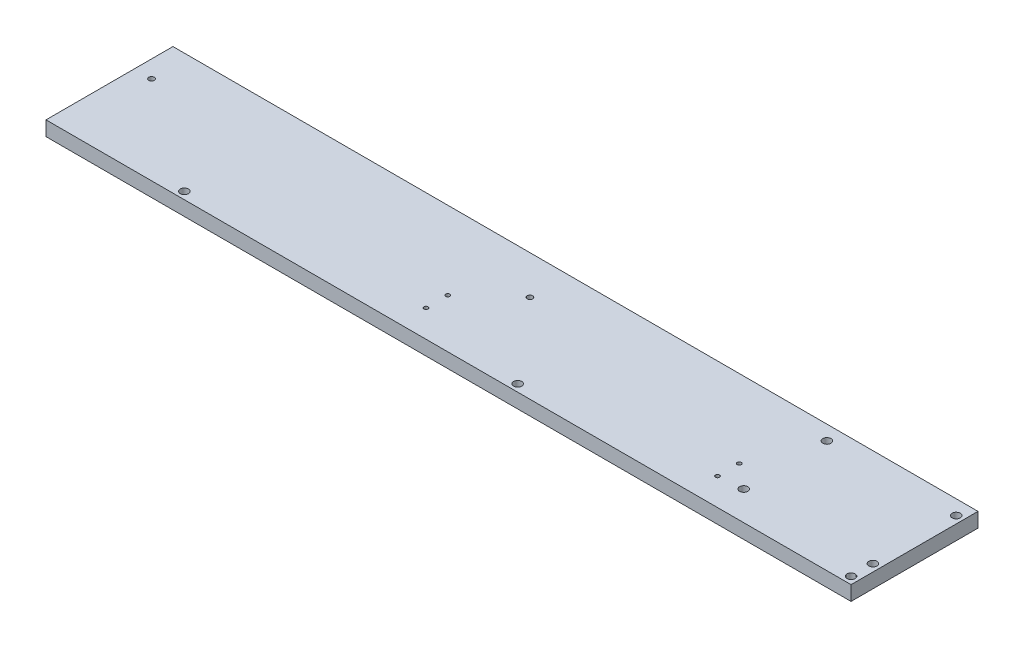
ISO-10303-21;
HEADER;
FILE_DESCRIPTION(('STEP AP214'),'2;1');
FILE_NAME('part.step','',(''),(''),'','','');
FILE_SCHEMA(('AUTOMOTIVE_DESIGN { 1 0 10303 214 1 1 1 1 }'));
ENDSEC;
DATA;
#1=APPLICATION_CONTEXT('core data for automotive mechanical design processes');
#2=APPLICATION_PROTOCOL_DEFINITION('international standard','automotive_design',2000,#1);
#3=PRODUCT_CONTEXT('',#1,'mechanical');
#4=PRODUCT('Part','Part','',(#3));
#5=PRODUCT_RELATED_PRODUCT_CATEGORY('part','',(#4));
#6=PRODUCT_DEFINITION_FORMATION('','',#4);
#7=PRODUCT_DEFINITION_CONTEXT('part definition',#1,'design');
#8=PRODUCT_DEFINITION('design','',#6,#7);
#9=PRODUCT_DEFINITION_SHAPE('','',#8);
#10=(LENGTH_UNIT() NAMED_UNIT(*) SI_UNIT(.MILLI.,.METRE.));
#11=(NAMED_UNIT(*) PLANE_ANGLE_UNIT() SI_UNIT($,.RADIAN.));
#12=(NAMED_UNIT(*) SI_UNIT($,.STERADIAN.) SOLID_ANGLE_UNIT());
#13=UNCERTAINTY_MEASURE_WITH_UNIT(LENGTH_MEASURE(1.E-05),#10,'distance_accuracy_value','');
#14=(GEOMETRIC_REPRESENTATION_CONTEXT(3) GLOBAL_UNCERTAINTY_ASSIGNED_CONTEXT((#13)) GLOBAL_UNIT_ASSIGNED_CONTEXT((#10,
#11,#12)) REPRESENTATION_CONTEXT('',''));
#15=CARTESIAN_POINT('',(0.,0.,0.));
#16=DIRECTION('',(0.,0.,1.));
#17=DIRECTION('',(1.,0.,0.));
#18=AXIS2_PLACEMENT_3D('',#15,#16,#17);
#19=CARTESIAN_POINT('',(0.,6.35,0.));
#20=DIRECTION('',(0.,1.,0.));
#21=DIRECTION('',(0.,0.,1.));
#22=AXIS2_PLACEMENT_3D('',#19,#20,#21);
#23=PLANE('',#22);
#24=CARTESIAN_POINT('',(-59.525,6.35,-49.));
#25=DIRECTION('',(0.,1.,0.));
#26=DIRECTION('',(0.,0.,1.));
#27=AXIS2_PLACEMENT_3D('',#24,#25,#26);
#28=CIRCLE('',#27,1.78593749999999);
#29=CARTESIAN_POINT('',(-59.525,6.35,-47.2140625));
#30=VERTEX_POINT('',#29);
#31=EDGE_CURVE('E214',#30,#30,#28,.T.);
#32=ORIENTED_EDGE('',*,*,#31,.F.);
#33=EDGE_LOOP('',(#32));
#34=FACE_BOUND('',#33,.T.);
#35=CARTESIAN_POINT('',(-3.17499999999998,6.35,-12.7));
#36=DIRECTION('',(0.,1.,0.));
#37=DIRECTION('',(0.,0.,1.));
#38=AXIS2_PLACEMENT_3D('',#35,#36,#37);
#39=CIRCLE('',#38,1.7859375);
#40=CARTESIAN_POINT('',(-3.17499999999998,6.35,-10.9140625));
#41=VERTEX_POINT('',#40);
#42=EDGE_CURVE('E198',#41,#41,#39,.T.);
#43=ORIENTED_EDGE('',*,*,#42,.F.);
#44=EDGE_LOOP('',(#43));
#45=FACE_BOUND('',#44,.T.);
#46=CARTESIAN_POINT('',(-3.175,6.35,-3.175));
#47=DIRECTION('',(0.,1.,0.));
#48=DIRECTION('',(0.,0.,1.));
#49=AXIS2_PLACEMENT_3D('',#46,#47,#48);
#50=CIRCLE('',#49,1.7859375);
#51=CARTESIAN_POINT('',(-3.175,6.35,-1.3890625));
#52=VERTEX_POINT('',#51);
#53=EDGE_CURVE('E182',#52,#52,#50,.T.);
#54=ORIENTED_EDGE('',*,*,#53,.F.);
#55=EDGE_LOOP('',(#54));
#56=FACE_BOUND('',#55,.T.);
#57=CARTESIAN_POINT('',(-178.49,6.35,-38.5));
#58=DIRECTION('',(0.,1.,0.));
#59=DIRECTION('',(0.,0.,1.));
#60=AXIS2_PLACEMENT_3D('',#57,#58,#59);
#61=CIRCLE('',#60,1.190625);
#62=CARTESIAN_POINT('',(-178.49,6.35,-37.309375));
#63=VERTEX_POINT('',#62);
#64=EDGE_CURVE('E166',#63,#63,#61,.T.);
#65=ORIENTED_EDGE('',*,*,#64,.F.);
#66=EDGE_LOOP('',(#65));
#67=FACE_BOUND('',#66,.T.);
#68=CARTESIAN_POINT('',(-70.1,6.35,-11.85));
#69=DIRECTION('',(0.,1.,0.));
#70=DIRECTION('',(0.,0.,1.));
#71=AXIS2_PLACEMENT_3D('',#68,#69,#70);
#72=CIRCLE('',#71,0.889000000000003);
#73=CARTESIAN_POINT('',(-70.1,6.35,-10.961));
#74=VERTEX_POINT('',#73);
#75=EDGE_CURVE('E150',#74,#74,#72,.T.);
#76=ORIENTED_EDGE('',*,*,#75,.F.);
#77=EDGE_LOOP('',(#76));
#78=FACE_BOUND('',#77,.T.);
#79=CARTESIAN_POINT('',(-197.16,6.35,-21.35));
#80=DIRECTION('',(0.,1.,0.));
#81=DIRECTION('',(0.,0.,1.));
#82=AXIS2_PLACEMENT_3D('',#79,#80,#81);
#83=CIRCLE('',#82,0.888999999999989);
#84=CARTESIAN_POINT('',(-197.16,6.35,-20.461));
#85=VERTEX_POINT('',#84);
#86=EDGE_CURVE('E134',#85,#85,#83,.T.);
#87=ORIENTED_EDGE('',*,*,#86,.F.);
#88=EDGE_LOOP('',(#87));
#89=FACE_BOUND('',#88,.T.);
#90=DIRECTION('',(0.,0.,1.));
#91=VECTOR('',#90,1.);
#92=CARTESIAN_POINT('',(-350.99,6.35,-55.35));
#93=LINE('',#92,#91);
#94=CARTESIAN_POINT('',(-350.99,6.35,-55.35));
#95=VERTEX_POINT('',#94);
#96=CARTESIAN_POINT('',(-350.99,6.35,0.));
#97=VERTEX_POINT('',#96);
#98=EDGE_CURVE('E92',#95,#97,#93,.T.);
#99=ORIENTED_EDGE('',*,*,#98,.T.);
#100=DIRECTION('',(1.,0.,0.));
#101=VECTOR('',#100,1.);
#102=CARTESIAN_POINT('',(-350.99,6.35,0.));
#103=LINE('',#102,#101);
#104=CARTESIAN_POINT('',(0.,6.35,0.));
#105=VERTEX_POINT('',#104);
#106=EDGE_CURVE('E87',#97,#105,#103,.T.);
#107=ORIENTED_EDGE('',*,*,#106,.T.);
#108=DIRECTION('',(0.,0.,-1.));
#109=VECTOR('',#108,1.);
#110=CARTESIAN_POINT('',(0.,6.35,0.));
#111=LINE('',#110,#109);
#112=CARTESIAN_POINT('',(0.,6.35,-55.35));
#113=VERTEX_POINT('',#112);
#114=EDGE_CURVE('E90',#105,#113,#111,.T.);
#115=ORIENTED_EDGE('',*,*,#114,.T.);
#116=DIRECTION('',(-1.,0.,0.));
#117=VECTOR('',#116,1.);
#118=CARTESIAN_POINT('',(0.,6.35,-55.35));
#119=LINE('',#118,#117);
#120=EDGE_CURVE('E57',#113,#95,#119,.T.);
#121=ORIENTED_EDGE('',*,*,#120,.T.);
#122=EDGE_LOOP('',(#99,#107,#115,#121));
#123=FACE_BOUND('',#122,.T.);
#124=CARTESIAN_POINT('',(-197.16,6.35,-11.85));
#125=DIRECTION('',(0.,1.,0.));
#126=DIRECTION('',(0.,0.,1.));
#127=AXIS2_PLACEMENT_3D('',#124,#125,#126);
#128=CIRCLE('',#127,0.88899999999999);
#129=CARTESIAN_POINT('',(-197.16,6.35,-10.961));
#130=VERTEX_POINT('',#129);
#131=EDGE_CURVE('E112',#130,#130,#128,.T.);
#132=ORIENTED_EDGE('',*,*,#131,.F.);
#133=EDGE_LOOP('',(#132));
#134=FACE_BOUND('',#133,.T.);
#135=CARTESIAN_POINT('',(-70.1,6.35,-21.35));
#136=DIRECTION('',(0.,1.,0.));
#137=DIRECTION('',(0.,0.,1.));
#138=AXIS2_PLACEMENT_3D('',#135,#136,#137);
#139=CIRCLE('',#138,0.889000000000002);
#140=CARTESIAN_POINT('',(-70.1,6.35,-20.461));
#141=VERTEX_POINT('',#140);
#142=EDGE_CURVE('E142',#141,#141,#139,.T.);
#143=ORIENTED_EDGE('',*,*,#142,.F.);
#144=EDGE_LOOP('',(#143));
#145=FACE_BOUND('',#144,.T.);
#146=CARTESIAN_POINT('',(-343.49,6.35,-38.5));
#147=DIRECTION('',(0.,1.,0.));
#148=DIRECTION('',(0.,0.,1.));
#149=AXIS2_PLACEMENT_3D('',#146,#147,#148);
#150=CIRCLE('',#149,1.19062499999998);
#151=CARTESIAN_POINT('',(-343.49,6.35,-37.309375));
#152=VERTEX_POINT('',#151);
#153=EDGE_CURVE('E158',#152,#152,#150,.T.);
#154=ORIENTED_EDGE('',*,*,#153,.F.);
#155=EDGE_LOOP('',(#154));
#156=FACE_BOUND('',#155,.T.);
#157=CARTESIAN_POINT('',(-293.84,6.35,-3.175));
#158=DIRECTION('',(0.,1.,0.));
#159=DIRECTION('',(0.,0.,1.));
#160=AXIS2_PLACEMENT_3D('',#157,#158,#159);
#161=CIRCLE('',#160,1.78593749999999);
#162=CARTESIAN_POINT('',(-293.84,6.35,-1.38906250000001));
#163=VERTEX_POINT('',#162);
#164=EDGE_CURVE('E174',#163,#163,#161,.T.);
#165=ORIENTED_EDGE('',*,*,#164,.F.);
#166=EDGE_LOOP('',(#165));
#167=FACE_BOUND('',#166,.T.);
#168=CARTESIAN_POINT('',(-3.175,6.35,-49.));
#169=DIRECTION('',(0.,1.,0.));
#170=DIRECTION('',(0.,0.,1.));
#171=AXIS2_PLACEMENT_3D('',#168,#169,#170);
#172=CIRCLE('',#171,1.7859375);
#173=CARTESIAN_POINT('',(-3.175,6.35,-47.2140625));
#174=VERTEX_POINT('',#173);
#175=EDGE_CURVE('E190',#174,#174,#172,.T.);
#176=ORIENTED_EDGE('',*,*,#175,.F.);
#177=EDGE_LOOP('',(#176));
#178=FACE_BOUND('',#177,.T.);
#179=CARTESIAN_POINT('',(-148.5075,6.35,-3.17500000000001));
#180=DIRECTION('',(0.,1.,0.));
#181=DIRECTION('',(0.,0.,1.));
#182=AXIS2_PLACEMENT_3D('',#179,#180,#181);
#183=CIRCLE('',#182,1.78593750000002);
#184=CARTESIAN_POINT('',(-148.5075,6.35,-1.38906249999999));
#185=VERTEX_POINT('',#184);
#186=EDGE_CURVE('E206',#185,#185,#183,.T.);
#187=ORIENTED_EDGE('',*,*,#186,.F.);
#188=EDGE_LOOP('',(#187));
#189=FACE_BOUND('',#188,.T.);
#190=CARTESIAN_POINT('',(-59.525,6.35,-12.7));
#191=DIRECTION('',(0.,1.,0.));
#192=DIRECTION('',(0.,0.,1.));
#193=AXIS2_PLACEMENT_3D('',#190,#191,#192);
#194=CIRCLE('',#193,1.7859375);
#195=CARTESIAN_POINT('',(-59.525,6.35,-10.9140625));
#196=VERTEX_POINT('',#195);
#197=EDGE_CURVE('E222',#196,#196,#194,.T.);
#198=ORIENTED_EDGE('',*,*,#197,.F.);
#199=EDGE_LOOP('',(#198));
#200=FACE_BOUND('',#199,.T.);
#201=ADVANCED_FACE('F39',(#34,#45,#56,#67,#78,#89,#123,#134,#145,#156,#167,#178,#189,#200),#23,.T.);
#202=CARTESIAN_POINT('',(0.,0.,0.));
#203=DIRECTION('',(0.,1.,0.));
#204=DIRECTION('',(0.,0.,1.));
#205=AXIS2_PLACEMENT_3D('',#202,#203,#204);
#206=PLANE('',#205);
#207=DIRECTION('',(0.,0.,1.));
#208=VECTOR('',#207,1.);
#209=CARTESIAN_POINT('',(-350.99,0.,-55.35));
#210=LINE('',#209,#208);
#211=CARTESIAN_POINT('',(-350.99,0.,-55.35));
#212=VERTEX_POINT('',#211);
#213=CARTESIAN_POINT('',(-350.99,0.,0.));
#214=VERTEX_POINT('',#213);
#215=EDGE_CURVE('E108',#212,#214,#210,.T.);
#216=ORIENTED_EDGE('',*,*,#215,.F.);
#217=DIRECTION('',(-1.,0.,0.));
#218=VECTOR('',#217,1.);
#219=CARTESIAN_POINT('',(0.,0.,-55.35));
#220=LINE('',#219,#218);
#221=CARTESIAN_POINT('',(0.,0.,-55.35));
#222=VERTEX_POINT('',#221);
#223=EDGE_CURVE('E80',#222,#212,#220,.T.);
#224=ORIENTED_EDGE('',*,*,#223,.F.);
#225=DIRECTION('',(0.,0.,-1.));
#226=VECTOR('',#225,1.);
#227=CARTESIAN_POINT('',(0.,0.,0.));
#228=LINE('',#227,#226);
#229=CARTESIAN_POINT('',(0.,0.,0.));
#230=VERTEX_POINT('',#229);
#231=EDGE_CURVE('E74',#230,#222,#228,.T.);
#232=ORIENTED_EDGE('',*,*,#231,.F.);
#233=DIRECTION('',(1.,0.,0.));
#234=VECTOR('',#233,1.);
#235=CARTESIAN_POINT('',(-350.99,0.,0.));
#236=LINE('',#235,#234);
#237=EDGE_CURVE('E97',#214,#230,#236,.T.);
#238=ORIENTED_EDGE('',*,*,#237,.F.);
#239=EDGE_LOOP('',(#216,#224,#232,#238));
#240=FACE_BOUND('',#239,.T.);
#241=CARTESIAN_POINT('',(-197.16,0.,-11.85));
#242=DIRECTION('',(0.,1.,0.));
#243=DIRECTION('',(0.,0.,1.));
#244=AXIS2_PLACEMENT_3D('',#241,#242,#243);
#245=CIRCLE('',#244,0.88899999999999);
#246=CARTESIAN_POINT('',(-197.16,0.,-10.961));
#247=VERTEX_POINT('',#246);
#248=EDGE_CURVE('E130',#247,#247,#245,.T.);
#249=ORIENTED_EDGE('',*,*,#248,.T.);
#250=EDGE_LOOP('',(#249));
#251=FACE_BOUND('',#250,.T.);
#252=CARTESIAN_POINT('',(-197.16,0.,-21.35));
#253=DIRECTION('',(0.,1.,0.));
#254=DIRECTION('',(0.,0.,1.));
#255=AXIS2_PLACEMENT_3D('',#252,#253,#254);
#256=CIRCLE('',#255,0.888999999999989);
#257=CARTESIAN_POINT('',(-197.16,0.,-20.461));
#258=VERTEX_POINT('',#257);
#259=EDGE_CURVE('E138',#258,#258,#256,.T.);
#260=ORIENTED_EDGE('',*,*,#259,.T.);
#261=EDGE_LOOP('',(#260));
#262=FACE_BOUND('',#261,.T.);
#263=CARTESIAN_POINT('',(-70.1,0.,-21.35));
#264=DIRECTION('',(0.,1.,0.));
#265=DIRECTION('',(0.,0.,1.));
#266=AXIS2_PLACEMENT_3D('',#263,#264,#265);
#267=CIRCLE('',#266,0.889000000000002);
#268=CARTESIAN_POINT('',(-70.1,0.,-20.461));
#269=VERTEX_POINT('',#268);
#270=EDGE_CURVE('E146',#269,#269,#267,.T.);
#271=ORIENTED_EDGE('',*,*,#270,.T.);
#272=EDGE_LOOP('',(#271));
#273=FACE_BOUND('',#272,.T.);
#274=CARTESIAN_POINT('',(-70.1,0.,-11.85));
#275=DIRECTION('',(0.,1.,0.));
#276=DIRECTION('',(0.,0.,1.));
#277=AXIS2_PLACEMENT_3D('',#274,#275,#276);
#278=CIRCLE('',#277,0.889000000000003);
#279=CARTESIAN_POINT('',(-70.1,0.,-10.961));
#280=VERTEX_POINT('',#279);
#281=EDGE_CURVE('E154',#280,#280,#278,.T.);
#282=ORIENTED_EDGE('',*,*,#281,.T.);
#283=EDGE_LOOP('',(#282));
#284=FACE_BOUND('',#283,.T.);
#285=CARTESIAN_POINT('',(-343.49,0.,-38.5));
#286=DIRECTION('',(0.,1.,0.));
#287=DIRECTION('',(0.,0.,1.));
#288=AXIS2_PLACEMENT_3D('',#285,#286,#287);
#289=CIRCLE('',#288,1.19062499999998);
#290=CARTESIAN_POINT('',(-343.49,0.,-37.309375));
#291=VERTEX_POINT('',#290);
#292=EDGE_CURVE('E162',#291,#291,#289,.T.);
#293=ORIENTED_EDGE('',*,*,#292,.T.);
#294=EDGE_LOOP('',(#293));
#295=FACE_BOUND('',#294,.T.);
#296=CARTESIAN_POINT('',(-178.49,0.,-38.5));
#297=DIRECTION('',(0.,1.,0.));
#298=DIRECTION('',(0.,0.,1.));
#299=AXIS2_PLACEMENT_3D('',#296,#297,#298);
#300=CIRCLE('',#299,1.190625);
#301=CARTESIAN_POINT('',(-178.49,0.,-37.309375));
#302=VERTEX_POINT('',#301);
#303=EDGE_CURVE('E170',#302,#302,#300,.T.);
#304=ORIENTED_EDGE('',*,*,#303,.T.);
#305=EDGE_LOOP('',(#304));
#306=FACE_BOUND('',#305,.T.);
#307=CARTESIAN_POINT('',(-293.84,0.,-3.175));
#308=DIRECTION('',(0.,1.,0.));
#309=DIRECTION('',(0.,0.,1.));
#310=AXIS2_PLACEMENT_3D('',#307,#308,#309);
#311=CIRCLE('',#310,1.78593749999999);
#312=CARTESIAN_POINT('',(-293.84,0.,-1.38906250000001));
#313=VERTEX_POINT('',#312);
#314=EDGE_CURVE('E178',#313,#313,#311,.T.);
#315=ORIENTED_EDGE('',*,*,#314,.T.);
#316=EDGE_LOOP('',(#315));
#317=FACE_BOUND('',#316,.T.);
#318=CARTESIAN_POINT('',(-3.175,0.,-3.175));
#319=DIRECTION('',(0.,1.,0.));
#320=DIRECTION('',(0.,0.,1.));
#321=AXIS2_PLACEMENT_3D('',#318,#319,#320);
#322=CIRCLE('',#321,1.7859375);
#323=CARTESIAN_POINT('',(-3.175,0.,-1.3890625));
#324=VERTEX_POINT('',#323);
#325=EDGE_CURVE('E186',#324,#324,#322,.T.);
#326=ORIENTED_EDGE('',*,*,#325,.T.);
#327=EDGE_LOOP('',(#326));
#328=FACE_BOUND('',#327,.T.);
#329=CARTESIAN_POINT('',(-3.175,0.,-49.));
#330=DIRECTION('',(0.,1.,0.));
#331=DIRECTION('',(0.,0.,1.));
#332=AXIS2_PLACEMENT_3D('',#329,#330,#331);
#333=CIRCLE('',#332,1.7859375);
#334=CARTESIAN_POINT('',(-3.175,0.,-47.2140625));
#335=VERTEX_POINT('',#334);
#336=EDGE_CURVE('E194',#335,#335,#333,.T.);
#337=ORIENTED_EDGE('',*,*,#336,.T.);
#338=EDGE_LOOP('',(#337));
#339=FACE_BOUND('',#338,.T.);
#340=CARTESIAN_POINT('',(-3.17499999999998,0.,-12.7));
#341=DIRECTION('',(0.,1.,0.));
#342=DIRECTION('',(0.,0.,1.));
#343=AXIS2_PLACEMENT_3D('',#340,#341,#342);
#344=CIRCLE('',#343,1.7859375);
#345=CARTESIAN_POINT('',(-3.17499999999998,0.,-10.9140625));
#346=VERTEX_POINT('',#345);
#347=EDGE_CURVE('E202',#346,#346,#344,.T.);
#348=ORIENTED_EDGE('',*,*,#347,.T.);
#349=EDGE_LOOP('',(#348));
#350=FACE_BOUND('',#349,.T.);
#351=CARTESIAN_POINT('',(-148.5075,0.,-3.17500000000001));
#352=DIRECTION('',(0.,1.,0.));
#353=DIRECTION('',(0.,0.,1.));
#354=AXIS2_PLACEMENT_3D('',#351,#352,#353);
#355=CIRCLE('',#354,1.78593750000002);
#356=CARTESIAN_POINT('',(-148.5075,0.,-1.38906249999999));
#357=VERTEX_POINT('',#356);
#358=EDGE_CURVE('E210',#357,#357,#355,.T.);
#359=ORIENTED_EDGE('',*,*,#358,.T.);
#360=EDGE_LOOP('',(#359));
#361=FACE_BOUND('',#360,.T.);
#362=CARTESIAN_POINT('',(-59.525,0.,-49.));
#363=DIRECTION('',(0.,1.,0.));
#364=DIRECTION('',(0.,0.,1.));
#365=AXIS2_PLACEMENT_3D('',#362,#363,#364);
#366=CIRCLE('',#365,1.78593749999999);
#367=CARTESIAN_POINT('',(-59.525,0.,-47.2140625));
#368=VERTEX_POINT('',#367);
#369=EDGE_CURVE('E218',#368,#368,#366,.T.);
#370=ORIENTED_EDGE('',*,*,#369,.T.);
#371=EDGE_LOOP('',(#370));
#372=FACE_BOUND('',#371,.T.);
#373=CARTESIAN_POINT('',(-59.525,0.,-12.7));
#374=DIRECTION('',(0.,1.,0.));
#375=DIRECTION('',(0.,0.,1.));
#376=AXIS2_PLACEMENT_3D('',#373,#374,#375);
#377=CIRCLE('',#376,1.7859375);
#378=CARTESIAN_POINT('',(-59.525,0.,-10.9140625));
#379=VERTEX_POINT('',#378);
#380=EDGE_CURVE('E226',#379,#379,#377,.T.);
#381=ORIENTED_EDGE('',*,*,#380,.T.);
#382=EDGE_LOOP('',(#381));
#383=FACE_BOUND('',#382,.T.);
#384=ADVANCED_FACE('F125',(#240,#251,#262,#273,#284,#295,#306,#317,#328,#339,#350,#361,#372,
#383),#206,.F.);
#385=CARTESIAN_POINT('',(-350.99,6.35,-55.35));
#386=DIRECTION('',(1.,0.,0.));
#387=DIRECTION('',(0.,0.,-1.));
#388=AXIS2_PLACEMENT_3D('',#385,#386,#387);
#389=PLANE('',#388);
#390=ORIENTED_EDGE('',*,*,#215,.T.);
#391=DIRECTION('',(0.,-1.,0.));
#392=VECTOR('',#391,1.);
#393=CARTESIAN_POINT('',(-350.99,6.35,0.));
#394=LINE('',#393,#392);
#395=EDGE_CURVE('E11',#97,#214,#394,.T.);
#396=ORIENTED_EDGE('',*,*,#395,.F.);
#397=ORIENTED_EDGE('',*,*,#98,.F.);
#398=DIRECTION('',(0.,-1.,0.));
#399=VECTOR('',#398,1.);
#400=CARTESIAN_POINT('',(-350.99,6.35,-55.35));
#401=LINE('',#400,#399);
#402=EDGE_CURVE('E104',#95,#212,#401,.T.);
#403=ORIENTED_EDGE('',*,*,#402,.T.);
#404=EDGE_LOOP('',(#390,#396,#397,#403));
#405=FACE_BOUND('',#404,.T.);
#406=ADVANCED_FACE('F41',(#405),#389,.F.);
#407=CARTESIAN_POINT('',(-350.99,6.35,0.));
#408=DIRECTION('',(0.,0.,-1.));
#409=DIRECTION('',(-1.,0.,0.));
#410=AXIS2_PLACEMENT_3D('',#407,#408,#409);
#411=PLANE('',#410);
#412=ORIENTED_EDGE('',*,*,#237,.T.);
#413=DIRECTION('',(0.,-1.,0.));
#414=VECTOR('',#413,1.);
#415=CARTESIAN_POINT('',(0.,6.35,0.));
#416=LINE('',#415,#414);
#417=EDGE_CURVE('E49',#105,#230,#416,.T.);
#418=ORIENTED_EDGE('',*,*,#417,.F.);
#419=ORIENTED_EDGE('',*,*,#106,.F.);
#420=ORIENTED_EDGE('',*,*,#395,.T.);
#421=EDGE_LOOP('',(#412,#418,#419,#420));
#422=FACE_BOUND('',#421,.T.);
#423=ADVANCED_FACE('F96',(#422),#411,.F.);
#424=CARTESIAN_POINT('',(0.,6.35,0.));
#425=DIRECTION('',(-1.,0.,0.));
#426=DIRECTION('',(0.,0.,1.));
#427=AXIS2_PLACEMENT_3D('',#424,#425,#426);
#428=PLANE('',#427);
#429=ORIENTED_EDGE('',*,*,#231,.T.);
#430=DIRECTION('',(0.,-1.,0.));
#431=VECTOR('',#430,1.);
#432=CARTESIAN_POINT('',(0.,6.35,-55.35));
#433=LINE('',#432,#431);
#434=EDGE_CURVE('E99',#113,#222,#433,.T.);
#435=ORIENTED_EDGE('',*,*,#434,.F.);
#436=ORIENTED_EDGE('',*,*,#114,.F.);
#437=ORIENTED_EDGE('',*,*,#417,.T.);
#438=EDGE_LOOP('',(#429,#435,#436,#437));
#439=FACE_BOUND('',#438,.T.);
#440=ADVANCED_FACE('F100',(#439),#428,.F.);
#441=CARTESIAN_POINT('',(0.,6.35,-55.35));
#442=DIRECTION('',(0.,0.,1.));
#443=DIRECTION('',(1.,0.,0.));
#444=AXIS2_PLACEMENT_3D('',#441,#442,#443);
#445=PLANE('',#444);
#446=ORIENTED_EDGE('',*,*,#223,.T.);
#447=ORIENTED_EDGE('',*,*,#402,.F.);
#448=ORIENTED_EDGE('',*,*,#120,.F.);
#449=ORIENTED_EDGE('',*,*,#434,.T.);
#450=EDGE_LOOP('',(#446,#447,#448,#449));
#451=FACE_BOUND('',#450,.T.);
#452=ADVANCED_FACE('F122',(#451),#445,.F.);
#453=CARTESIAN_POINT('',(-197.16,6.35,-11.85));
#454=DIRECTION('',(0.,-1.,0.));
#455=DIRECTION('',(0.,0.,-1.));
#456=AXIS2_PLACEMENT_3D('',#453,#454,#455);
#457=CYLINDRICAL_SURFACE('',#456,0.88899999999999);
#458=ORIENTED_EDGE('',*,*,#131,.T.);
#459=EDGE_LOOP('',(#458));
#460=FACE_BOUND('',#459,.T.);
#461=ORIENTED_EDGE('',*,*,#248,.F.);
#462=EDGE_LOOP('',(#461));
#463=FACE_BOUND('',#462,.T.);
#464=ADVANCED_FACE('F247',(#460,#463),#457,.F.);
#465=CARTESIAN_POINT('',(-197.16,6.35,-21.35));
#466=DIRECTION('',(0.,-1.,0.));
#467=DIRECTION('',(0.,0.,-1.));
#468=AXIS2_PLACEMENT_3D('',#465,#466,#467);
#469=CYLINDRICAL_SURFACE('',#468,0.888999999999989);
#470=ORIENTED_EDGE('',*,*,#86,.T.);
#471=EDGE_LOOP('',(#470));
#472=FACE_BOUND('',#471,.T.);
#473=ORIENTED_EDGE('',*,*,#259,.F.);
#474=EDGE_LOOP('',(#473));
#475=FACE_BOUND('',#474,.T.);
#476=ADVANCED_FACE('F293',(#472,#475),#469,.F.);
#477=CARTESIAN_POINT('',(-70.1,6.35,-21.35));
#478=DIRECTION('',(0.,-1.,0.));
#479=DIRECTION('',(0.,0.,-1.));
#480=AXIS2_PLACEMENT_3D('',#477,#478,#479);
#481=CYLINDRICAL_SURFACE('',#480,0.889000000000002);
#482=ORIENTED_EDGE('',*,*,#142,.T.);
#483=EDGE_LOOP('',(#482));
#484=FACE_BOUND('',#483,.T.);
#485=ORIENTED_EDGE('',*,*,#270,.F.);
#486=EDGE_LOOP('',(#485));
#487=FACE_BOUND('',#486,.T.);
#488=ADVANCED_FACE('F301',(#484,#487),#481,.F.);
#489=CARTESIAN_POINT('',(-70.1,6.35,-11.85));
#490=DIRECTION('',(0.,-1.,0.));
#491=DIRECTION('',(0.,0.,-1.));
#492=AXIS2_PLACEMENT_3D('',#489,#490,#491);
#493=CYLINDRICAL_SURFACE('',#492,0.889000000000003);
#494=ORIENTED_EDGE('',*,*,#75,.T.);
#495=EDGE_LOOP('',(#494));
#496=FACE_BOUND('',#495,.T.);
#497=ORIENTED_EDGE('',*,*,#281,.F.);
#498=EDGE_LOOP('',(#497));
#499=FACE_BOUND('',#498,.T.);
#500=ADVANCED_FACE('F309',(#496,#499),#493,.F.);
#501=CARTESIAN_POINT('',(-343.49,6.35,-38.5));
#502=DIRECTION('',(0.,-1.,0.));
#503=DIRECTION('',(0.,0.,-1.));
#504=AXIS2_PLACEMENT_3D('',#501,#502,#503);
#505=CYLINDRICAL_SURFACE('',#504,1.19062499999998);
#506=ORIENTED_EDGE('',*,*,#153,.T.);
#507=EDGE_LOOP('',(#506));
#508=FACE_BOUND('',#507,.T.);
#509=ORIENTED_EDGE('',*,*,#292,.F.);
#510=EDGE_LOOP('',(#509));
#511=FACE_BOUND('',#510,.T.);
#512=ADVANCED_FACE('F318',(#508,#511),#505,.F.);
#513=CARTESIAN_POINT('',(-178.49,6.35,-38.5));
#514=DIRECTION('',(0.,-1.,0.));
#515=DIRECTION('',(0.,0.,-1.));
#516=AXIS2_PLACEMENT_3D('',#513,#514,#515);
#517=CYLINDRICAL_SURFACE('',#516,1.190625);
#518=ORIENTED_EDGE('',*,*,#64,.T.);
#519=EDGE_LOOP('',(#518));
#520=FACE_BOUND('',#519,.T.);
#521=ORIENTED_EDGE('',*,*,#303,.F.);
#522=EDGE_LOOP('',(#521));
#523=FACE_BOUND('',#522,.T.);
#524=ADVANCED_FACE('F327',(#520,#523),#517,.F.);
#525=CARTESIAN_POINT('',(-293.84,6.35,-3.175));
#526=DIRECTION('',(0.,-1.,0.));
#527=DIRECTION('',(0.,0.,-1.));
#528=AXIS2_PLACEMENT_3D('',#525,#526,#527);
#529=CYLINDRICAL_SURFACE('',#528,1.78593749999999);
#530=ORIENTED_EDGE('',*,*,#164,.T.);
#531=EDGE_LOOP('',(#530));
#532=FACE_BOUND('',#531,.T.);
#533=ORIENTED_EDGE('',*,*,#314,.F.);
#534=EDGE_LOOP('',(#533));
#535=FACE_BOUND('',#534,.T.);
#536=ADVANCED_FACE('F336',(#532,#535),#529,.F.);
#537=CARTESIAN_POINT('',(-3.175,6.35,-3.175));
#538=DIRECTION('',(0.,-1.,0.));
#539=DIRECTION('',(0.,0.,-1.));
#540=AXIS2_PLACEMENT_3D('',#537,#538,#539);
#541=CYLINDRICAL_SURFACE('',#540,1.7859375);
#542=ORIENTED_EDGE('',*,*,#53,.T.);
#543=EDGE_LOOP('',(#542));
#544=FACE_BOUND('',#543,.T.);
#545=ORIENTED_EDGE('',*,*,#325,.F.);
#546=EDGE_LOOP('',(#545));
#547=FACE_BOUND('',#546,.T.);
#548=ADVANCED_FACE('F345',(#544,#547),#541,.F.);
#549=CARTESIAN_POINT('',(-3.175,6.35,-49.));
#550=DIRECTION('',(0.,-1.,0.));
#551=DIRECTION('',(0.,0.,-1.));
#552=AXIS2_PLACEMENT_3D('',#549,#550,#551);
#553=CYLINDRICAL_SURFACE('',#552,1.7859375);
#554=ORIENTED_EDGE('',*,*,#175,.T.);
#555=EDGE_LOOP('',(#554));
#556=FACE_BOUND('',#555,.T.);
#557=ORIENTED_EDGE('',*,*,#336,.F.);
#558=EDGE_LOOP('',(#557));
#559=FACE_BOUND('',#558,.T.);
#560=ADVANCED_FACE('F354',(#556,#559),#553,.F.);
#561=CARTESIAN_POINT('',(-3.17499999999998,6.35,-12.7));
#562=DIRECTION('',(0.,-1.,0.));
#563=DIRECTION('',(0.,0.,-1.));
#564=AXIS2_PLACEMENT_3D('',#561,#562,#563);
#565=CYLINDRICAL_SURFACE('',#564,1.7859375);
#566=ORIENTED_EDGE('',*,*,#42,.T.);
#567=EDGE_LOOP('',(#566));
#568=FACE_BOUND('',#567,.T.);
#569=ORIENTED_EDGE('',*,*,#347,.F.);
#570=EDGE_LOOP('',(#569));
#571=FACE_BOUND('',#570,.T.);
#572=ADVANCED_FACE('F363',(#568,#571),#565,.F.);
#573=CARTESIAN_POINT('',(-148.5075,6.35,-3.17500000000001));
#574=DIRECTION('',(0.,-1.,0.));
#575=DIRECTION('',(0.,0.,-1.));
#576=AXIS2_PLACEMENT_3D('',#573,#574,#575);
#577=CYLINDRICAL_SURFACE('',#576,1.78593750000002);
#578=ORIENTED_EDGE('',*,*,#186,.T.);
#579=EDGE_LOOP('',(#578));
#580=FACE_BOUND('',#579,.T.);
#581=ORIENTED_EDGE('',*,*,#358,.F.);
#582=EDGE_LOOP('',(#581));
#583=FACE_BOUND('',#582,.T.);
#584=ADVANCED_FACE('F372',(#580,#583),#577,.F.);
#585=CARTESIAN_POINT('',(-59.525,6.35,-49.));
#586=DIRECTION('',(0.,-1.,0.));
#587=DIRECTION('',(0.,0.,-1.));
#588=AXIS2_PLACEMENT_3D('',#585,#586,#587);
#589=CYLINDRICAL_SURFACE('',#588,1.78593749999999);
#590=ORIENTED_EDGE('',*,*,#31,.T.);
#591=EDGE_LOOP('',(#590));
#592=FACE_BOUND('',#591,.T.);
#593=ORIENTED_EDGE('',*,*,#369,.F.);
#594=EDGE_LOOP('',(#593));
#595=FACE_BOUND('',#594,.T.);
#596=ADVANCED_FACE('F381',(#592,#595),#589,.F.);
#597=CARTESIAN_POINT('',(-59.525,6.35,-12.7));
#598=DIRECTION('',(0.,-1.,0.));
#599=DIRECTION('',(0.,0.,-1.));
#600=AXIS2_PLACEMENT_3D('',#597,#598,#599);
#601=CYLINDRICAL_SURFACE('',#600,1.7859375);
#602=ORIENTED_EDGE('',*,*,#197,.T.);
#603=EDGE_LOOP('',(#602));
#604=FACE_BOUND('',#603,.T.);
#605=ORIENTED_EDGE('',*,*,#380,.F.);
#606=EDGE_LOOP('',(#605));
#607=FACE_BOUND('',#606,.T.);
#608=ADVANCED_FACE('F234',(#604,#607),#601,.F.);
#609=CLOSED_SHELL('',(#201,#384,#406,#423,#440,#452,#464,#476,#488,#500,#512,#524,#536,#548,
#560,#572,#584,#596,#608));
#610=MANIFOLD_SOLID_BREP('B2',#609);
#611=ADVANCED_BREP_SHAPE_REPRESENTATION('',(#18,#610),#14);
#612=SHAPE_DEFINITION_REPRESENTATION(#9,#611);
ENDSEC;
END-ISO-10303-21;
